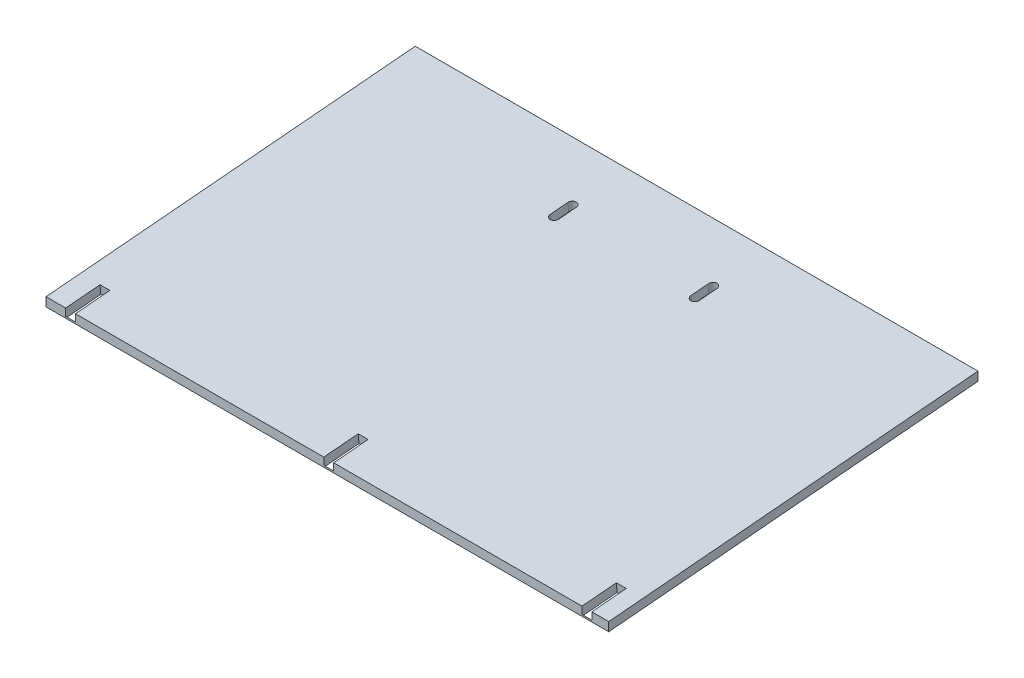
ISO-10303-21;
HEADER;
FILE_DESCRIPTION(('STEP AP214'),'2;1');
FILE_NAME('part.step','',(''),(''),'','','');
FILE_SCHEMA(('AUTOMOTIVE_DESIGN { 1 0 10303 214 1 1 1 1 }'));
ENDSEC;
DATA;
#1=APPLICATION_CONTEXT('core data for automotive mechanical design processes');
#2=APPLICATION_PROTOCOL_DEFINITION('international standard','automotive_design',2000,#1);
#3=PRODUCT_CONTEXT('',#1,'mechanical');
#4=PRODUCT('Part','Part','',(#3));
#5=PRODUCT_RELATED_PRODUCT_CATEGORY('part','',(#4));
#6=PRODUCT_DEFINITION_FORMATION('','',#4);
#7=PRODUCT_DEFINITION_CONTEXT('part definition',#1,'design');
#8=PRODUCT_DEFINITION('design','',#6,#7);
#9=PRODUCT_DEFINITION_SHAPE('','',#8);
#10=(LENGTH_UNIT() NAMED_UNIT(*) SI_UNIT(.MILLI.,.METRE.));
#11=(NAMED_UNIT(*) PLANE_ANGLE_UNIT() SI_UNIT($,.RADIAN.));
#12=(NAMED_UNIT(*) SI_UNIT($,.STERADIAN.) SOLID_ANGLE_UNIT());
#13=UNCERTAINTY_MEASURE_WITH_UNIT(LENGTH_MEASURE(1.E-05),#10,'distance_accuracy_value','');
#14=(GEOMETRIC_REPRESENTATION_CONTEXT(3) GLOBAL_UNCERTAINTY_ASSIGNED_CONTEXT((#13)) GLOBAL_UNIT_ASSIGNED_CONTEXT((#10,
#11,#12)) REPRESENTATION_CONTEXT('',''));
#15=CARTESIAN_POINT('',(0.,0.,0.));
#16=DIRECTION('',(0.,0.,1.));
#17=DIRECTION('',(1.,0.,0.));
#18=AXIS2_PLACEMENT_3D('',#15,#16,#17);
#19=CARTESIAN_POINT('',(203.2,4.14200956729703,-241.299999999994));
#20=DIRECTION('',(0.,0.,1.));
#21=DIRECTION('',(1.,0.,0.));
#22=AXIS2_PLACEMENT_3D('',#19,#20,#21);
#23=PLANE('',#22);
#24=DIRECTION('',(0.,1.,0.));
#25=VECTOR('',#24,1.);
#26=CARTESIAN_POINT('',(0.,4.14200956729703,-241.299999999994));
#27=LINE('',#26,#25);
#28=CARTESIAN_POINT('',(0.,4.14200956729703,-241.299999999994));
#29=VERTEX_POINT('',#28);
#30=CARTESIAN_POINT('',(0.,7.32913755149716,-241.299999999994));
#31=VERTEX_POINT('',#30);
#32=EDGE_CURVE('E340',#29,#31,#27,.T.);
#33=ORIENTED_EDGE('',*,*,#32,.T.);
#34=DIRECTION('',(-1.,0.,0.));
#35=VECTOR('',#34,1.);
#36=CARTESIAN_POINT('',(203.2,7.32913755149716,-241.299999999994));
#37=LINE('',#36,#35);
#38=CARTESIAN_POINT('',(203.2,7.32913755149716,-241.299999999994));
#39=VERTEX_POINT('',#38);
#40=EDGE_CURVE('E393',#39,#31,#37,.T.);
#41=ORIENTED_EDGE('',*,*,#40,.F.);
#42=DIRECTION('',(0.,1.,0.));
#43=VECTOR('',#42,1.);
#44=CARTESIAN_POINT('',(203.2,4.14200956729703,-241.299999999994));
#45=LINE('',#44,#43);
#46=CARTESIAN_POINT('',(203.2,4.14200956729703,-241.299999999994));
#47=VERTEX_POINT('',#46);
#48=EDGE_CURVE('E365',#47,#39,#45,.T.);
#49=ORIENTED_EDGE('',*,*,#48,.F.);
#50=DIRECTION('',(-1.,0.,0.));
#51=VECTOR('',#50,1.);
#52=CARTESIAN_POINT('',(203.2,4.14200956729703,-241.299999999994));
#53=LINE('',#52,#51);
#54=EDGE_CURVE('E375',#47,#29,#53,.T.);
#55=ORIENTED_EDGE('',*,*,#54,.T.);
#56=EDGE_LOOP('',(#33,#41,#49,#55));
#57=FACE_BOUND('',#56,.T.);
#58=ADVANCED_FACE('F33',(#57),#23,.F.);
#59=CARTESIAN_POINT('',(203.2,7.32913755149716,-241.299999999994));
#60=DIRECTION('',(0.,-0.996194698091746,-0.0871557427476548));
#61=DIRECTION('',(0.,0.0871557427476548,-0.996194698091746));
#62=AXIS2_PLACEMENT_3D('',#59,#60,#61);
#63=PLANE('',#62);
#64=DIRECTION('',(0.,-0.087155742747655,0.996194698091746));
#65=VECTOR('',#64,1.);
#66=CARTESIAN_POINT('',(74.676,5.61347675550961,-221.689907368058));
#67=LINE('',#66,#65);
#68=CARTESIAN_POINT('',(74.676,5.61347675550961,-221.689907368058));
#69=VERTEX_POINT('',#68);
#70=CARTESIAN_POINT('',(74.676,5.060037789062,-215.364071035175));
#71=VERTEX_POINT('',#70);
#72=EDGE_CURVE('E327',#69,#71,#67,.T.);
#73=ORIENTED_EDGE('',*,*,#72,.F.);
#74=CARTESIAN_POINT('',(76.2,5.61347675550961,-221.689907368058));
#75=DIRECTION('',(0.,0.996194698091746,0.087155742747655));
#76=DIRECTION('',(0.,0.087155742747655,-0.996194698091746));
#77=AXIS2_PLACEMENT_3D('',#74,#75,#76);
#78=CIRCLE('',#77,1.524);
#79=CARTESIAN_POINT('',(77.724,5.61347675550961,-221.689907368058));
#80=VERTEX_POINT('',#79);
#81=EDGE_CURVE('E325',#80,#69,#78,.T.);
#82=ORIENTED_EDGE('',*,*,#81,.F.);
#83=DIRECTION('',(0.,0.0871557427476552,-0.996194698091746));
#84=VECTOR('',#83,1.);
#85=CARTESIAN_POINT('',(77.724,5.61347675550961,-221.689907368058));
#86=LINE('',#85,#84);
#87=CARTESIAN_POINT('',(77.724,5.060037789062,-215.364071035175));
#88=VERTEX_POINT('',#87);
#89=EDGE_CURVE('E334',#88,#80,#86,.T.);
#90=ORIENTED_EDGE('',*,*,#89,.F.);
#91=CARTESIAN_POINT('',(76.2,5.060037789062,-215.364071035175));
#92=DIRECTION('',(0.,0.996194698091746,0.087155742747655));
#93=DIRECTION('',(0.,0.087155742747655,-0.996194698091746));
#94=AXIS2_PLACEMENT_3D('',#91,#92,#93);
#95=CIRCLE('',#94,1.524);
#96=EDGE_CURVE('E331',#71,#88,#95,.T.);
#97=ORIENTED_EDGE('',*,*,#96,.F.);
#98=EDGE_LOOP('',(#73,#82,#90,#97));
#99=FACE_BOUND('',#98,.T.);
#100=DIRECTION('',(0.,-0.0871557427476554,0.996194698091746));
#101=VECTOR('',#100,1.);
#102=CARTESIAN_POINT('',(125.476,5.61347675550961,-221.689907368058));
#103=LINE('',#102,#101);
#104=CARTESIAN_POINT('',(125.476,5.61347675550961,-221.689907368058));
#105=VERTEX_POINT('',#104);
#106=CARTESIAN_POINT('',(125.476,5.060037789062,-215.364071035175));
#107=VERTEX_POINT('',#106);
#108=EDGE_CURVE('E348',#105,#107,#103,.T.);
#109=ORIENTED_EDGE('',*,*,#108,.F.);
#110=CARTESIAN_POINT('',(127.,5.61347675550961,-221.689907368058));
#111=DIRECTION('',(0.,0.996194698091746,0.087155742747655));
#112=DIRECTION('',(0.,-0.087155742747655,0.996194698091746));
#113=AXIS2_PLACEMENT_3D('',#110,#111,#112);
#114=CIRCLE('',#113,1.52400000000001);
#115=CARTESIAN_POINT('',(128.524,5.61347675550961,-221.689907368058));
#116=VERTEX_POINT('',#115);
#117=EDGE_CURVE('E259',#116,#105,#114,.T.);
#118=ORIENTED_EDGE('',*,*,#117,.F.);
#119=DIRECTION('',(0.,0.087155742747655,-0.996194698091746));
#120=VECTOR('',#119,1.);
#121=CARTESIAN_POINT('',(128.524,5.61347675550961,-221.689907368058));
#122=LINE('',#121,#120);
#123=CARTESIAN_POINT('',(128.524,5.060037789062,-215.364071035175));
#124=VERTEX_POINT('',#123);
#125=EDGE_CURVE('E354',#124,#116,#122,.T.);
#126=ORIENTED_EDGE('',*,*,#125,.F.);
#127=CARTESIAN_POINT('',(127.,5.060037789062,-215.364071035175));
#128=DIRECTION('',(0.,0.996194698091746,0.087155742747655));
#129=DIRECTION('',(0.,-0.087155742747655,0.996194698091746));
#130=AXIS2_PLACEMENT_3D('',#127,#128,#129);
#131=CIRCLE('',#130,1.52400000000001);
#132=EDGE_CURVE('E351',#107,#124,#131,.T.);
#133=ORIENTED_EDGE('',*,*,#132,.F.);
#134=EDGE_LOOP('',(#109,#118,#126,#133));
#135=FACE_BOUND('',#134,.T.);
#136=DIRECTION('',(-1.,0.,0.));
#137=VECTOR('',#136,1.);
#138=CARTESIAN_POINT('',(7.09259223505407,-3.25016331284369,-120.378037793925));
#139=LINE('',#138,#137);
#140=CARTESIAN_POINT('',(10.6485922350541,-3.25016331284369,-120.378037793925));
#141=VERTEX_POINT('',#140);
#142=CARTESIAN_POINT('',(7.09259223505407,-3.25016331284369,-120.378037793925));
#143=VERTEX_POINT('',#142);
#144=EDGE_CURVE('E248',#141,#143,#139,.T.);
#145=ORIENTED_EDGE('',*,*,#144,.F.);
#146=DIRECTION('',(0.,0.0871557427476549,-0.996194698091746));
#147=VECTOR('',#146,1.);
#148=CARTESIAN_POINT('',(10.6485922350541,-4.35704124573891,-107.72636512816));
#149=LINE('',#148,#147);
#150=CARTESIAN_POINT('',(10.6485922350541,-4.33747572968438,-107.949999999993));
#151=VERTEX_POINT('',#150);
#152=EDGE_CURVE('E245',#151,#141,#149,.T.);
#153=ORIENTED_EDGE('',*,*,#152,.F.);
#154=DIRECTION('',(-1.,0.,0.));
#155=VECTOR('',#154,1.);
#156=CARTESIAN_POINT('',(203.2,-4.33747572968438,-107.949999999993));
#157=LINE('',#156,#155);
#158=CARTESIAN_POINT('',(100.310592235054,-4.33747572968438,-107.949999999993));
#159=VERTEX_POINT('',#158);
#160=EDGE_CURVE('E471',#159,#151,#157,.T.);
#161=ORIENTED_EDGE('',*,*,#160,.F.);
#162=DIRECTION('',(0.,-0.0871557427476549,0.996194698091746));
#163=VECTOR('',#162,1.);
#164=CARTESIAN_POINT('',(100.310592235054,-4.35704124573891,-107.72636512816));
#165=LINE('',#164,#163);
#166=CARTESIAN_POINT('',(100.310592235054,-3.25016331284369,-120.378037793925));
#167=VERTEX_POINT('',#166);
#168=EDGE_CURVE('E281',#167,#159,#165,.T.);
#169=ORIENTED_EDGE('',*,*,#168,.F.);
#170=DIRECTION('',(-1.,0.,0.));
#171=VECTOR('',#170,1.);
#172=CARTESIAN_POINT('',(100.310592235054,-3.25016331284369,-120.378037793925));
#173=LINE('',#172,#171);
#174=CARTESIAN_POINT('',(103.866592235054,-3.25016331284369,-120.378037793925));
#175=VERTEX_POINT('',#174);
#176=EDGE_CURVE('E278',#175,#167,#173,.T.);
#177=ORIENTED_EDGE('',*,*,#176,.F.);
#178=DIRECTION('',(0.,0.0871557427476549,-0.996194698091746));
#179=VECTOR('',#178,1.);
#180=CARTESIAN_POINT('',(103.866592235054,-4.35704124573891,-107.72636512816));
#181=LINE('',#180,#179);
#182=CARTESIAN_POINT('',(103.866592235054,-4.33747572968438,-107.949999999993));
#183=VERTEX_POINT('',#182);
#184=EDGE_CURVE('E275',#183,#175,#181,.T.);
#185=ORIENTED_EDGE('',*,*,#184,.F.);
#186=CARTESIAN_POINT('',(193.528592235054,-4.33747572968438,-107.949999999993));
#187=VERTEX_POINT('',#186);
#188=EDGE_CURVE('E394',#187,#183,#157,.T.);
#189=ORIENTED_EDGE('',*,*,#188,.F.);
#190=DIRECTION('',(0.,-0.0871557427476549,0.996194698091746));
#191=VECTOR('',#190,1.);
#192=CARTESIAN_POINT('',(193.528592235054,-4.35704124573891,-107.72636512816));
#193=LINE('',#192,#191);
#194=CARTESIAN_POINT('',(193.528592235054,-3.25016331284369,-120.378037793925));
#195=VERTEX_POINT('',#194);
#196=EDGE_CURVE('E313',#195,#187,#193,.T.);
#197=ORIENTED_EDGE('',*,*,#196,.F.);
#198=DIRECTION('',(-1.,0.,0.));
#199=VECTOR('',#198,1.);
#200=CARTESIAN_POINT('',(193.528592235054,-3.25016331284369,-120.378037793925));
#201=LINE('',#200,#199);
#202=CARTESIAN_POINT('',(197.084592235054,-3.25016331284369,-120.378037793925));
#203=VERTEX_POINT('',#202);
#204=EDGE_CURVE('E310',#203,#195,#201,.T.);
#205=ORIENTED_EDGE('',*,*,#204,.F.);
#206=DIRECTION('',(0.,0.0871557427476549,-0.996194698091746));
#207=VECTOR('',#206,1.);
#208=CARTESIAN_POINT('',(197.084592235054,-4.35704124573891,-107.72636512816));
#209=LINE('',#208,#207);
#210=CARTESIAN_POINT('',(197.084592235054,-4.33747572968438,-107.949999999993));
#211=VERTEX_POINT('',#210);
#212=EDGE_CURVE('E307',#211,#203,#209,.T.);
#213=ORIENTED_EDGE('',*,*,#212,.F.);
#214=CARTESIAN_POINT('',(203.2,-4.33747572968438,-107.949999999993));
#215=VERTEX_POINT('',#214);
#216=EDGE_CURVE('E390',#215,#211,#157,.T.);
#217=ORIENTED_EDGE('',*,*,#216,.F.);
#218=DIRECTION('',(0.,-0.0871557427476548,0.996194698091746));
#219=VECTOR('',#218,1.);
#220=CARTESIAN_POINT('',(203.2,7.32913755149716,-241.299999999994));
#221=LINE('',#220,#219);
#222=EDGE_CURVE('E368',#39,#215,#221,.T.);
#223=ORIENTED_EDGE('',*,*,#222,.F.);
#224=ORIENTED_EDGE('',*,*,#40,.T.);
#225=DIRECTION('',(0.,-0.0871557427476548,0.996194698091746));
#226=VECTOR('',#225,1.);
#227=CARTESIAN_POINT('',(0.,7.32913755149716,-241.299999999994));
#228=LINE('',#227,#226);
#229=CARTESIAN_POINT('',(0.,-4.33747572968438,-107.949999999993));
#230=VERTEX_POINT('',#229);
#231=EDGE_CURVE('E378',#31,#230,#228,.T.);
#232=ORIENTED_EDGE('',*,*,#231,.T.);
#233=CARTESIAN_POINT('',(7.09259223505407,-4.33747572968438,-107.949999999993));
#234=VERTEX_POINT('',#233);
#235=EDGE_CURVE('E389',#234,#230,#157,.T.);
#236=ORIENTED_EDGE('',*,*,#235,.F.);
#237=DIRECTION('',(0.,-0.0871557427476549,0.996194698091746));
#238=VECTOR('',#237,1.);
#239=CARTESIAN_POINT('',(7.09259223505407,-4.35704124573891,-107.72636512816));
#240=LINE('',#239,#238);
#241=EDGE_CURVE('E216',#143,#234,#240,.T.);
#242=ORIENTED_EDGE('',*,*,#241,.F.);
#243=EDGE_LOOP('',(#145,#153,#161,#169,#177,#185,#189,#197,#205,#213,#217,#223,#224,#232,#236,#242));
#244=FACE_BOUND('',#243,.T.);
#245=ADVANCED_FACE('F430',(#99,#135,#244),#63,.F.);
#246=CARTESIAN_POINT('',(203.2,-4.33747572968438,-107.949999999993));
#247=DIRECTION('',(0.,0.,-1.));
#248=DIRECTION('',(-1.,0.,0.));
#249=AXIS2_PLACEMENT_3D('',#246,#247,#248);
#250=PLANE('',#249);
#251=ORIENTED_EDGE('',*,*,#160,.T.);
#252=DIRECTION('',(0.,1.,0.));
#253=VECTOR('',#252,1.);
#254=CARTESIAN_POINT('',(10.6485922350541,-19.0990308860877,-107.949999999993));
#255=LINE('',#254,#253);
#256=CARTESIAN_POINT('',(10.6485922350541,-6.91319952752076,-107.949999999993));
#257=VERTEX_POINT('',#256);
#258=EDGE_CURVE('E235',#257,#151,#255,.T.);
#259=ORIENTED_EDGE('',*,*,#258,.F.);
#260=DIRECTION('',(1.,0.,0.));
#261=VECTOR('',#260,1.);
#262=CARTESIAN_POINT('',(7.09259223505407,-6.91319952752076,-107.949999999993));
#263=LINE('',#262,#261);
#264=CARTESIAN_POINT('',(7.09259223505407,-6.91319952752076,-107.949999999993));
#265=VERTEX_POINT('',#264);
#266=EDGE_CURVE('E220',#265,#257,#263,.T.);
#267=ORIENTED_EDGE('',*,*,#266,.F.);
#268=DIRECTION('',(0.,-1.,0.));
#269=VECTOR('',#268,1.);
#270=CARTESIAN_POINT('',(7.09259223505407,-19.0990308860877,-107.949999999993));
#271=LINE('',#270,#269);
#272=EDGE_CURVE('E210',#234,#265,#271,.T.);
#273=ORIENTED_EDGE('',*,*,#272,.F.);
#274=ORIENTED_EDGE('',*,*,#235,.T.);
#275=DIRECTION('',(0.,-1.,0.));
#276=VECTOR('',#275,1.);
#277=CARTESIAN_POINT('',(0.,-4.33747572968438,-107.949999999993));
#278=LINE('',#277,#276);
#279=CARTESIAN_POINT('',(0.,-7.52460371388452,-107.949999999993));
#280=VERTEX_POINT('',#279);
#281=EDGE_CURVE('E381',#230,#280,#278,.T.);
#282=ORIENTED_EDGE('',*,*,#281,.T.);
#283=DIRECTION('',(-1.,0.,0.));
#284=VECTOR('',#283,1.);
#285=CARTESIAN_POINT('',(203.2,-7.52460371388452,-107.949999999993));
#286=LINE('',#285,#284);
#287=CARTESIAN_POINT('',(203.2,-7.52460371388452,-107.949999999993));
#288=VERTEX_POINT('',#287);
#289=EDGE_CURVE('E386',#288,#280,#286,.T.);
#290=ORIENTED_EDGE('',*,*,#289,.F.);
#291=DIRECTION('',(0.,-1.,0.));
#292=VECTOR('',#291,1.);
#293=CARTESIAN_POINT('',(203.2,-4.33747572968438,-107.949999999993));
#294=LINE('',#293,#292);
#295=EDGE_CURVE('E371',#215,#288,#294,.T.);
#296=ORIENTED_EDGE('',*,*,#295,.F.);
#297=ORIENTED_EDGE('',*,*,#216,.T.);
#298=DIRECTION('',(0.,1.,0.));
#299=VECTOR('',#298,1.);
#300=CARTESIAN_POINT('',(197.084592235054,-19.0990308860877,-107.949999999993));
#301=LINE('',#300,#299);
#302=CARTESIAN_POINT('',(197.084592235054,-6.91319952752076,-107.949999999993));
#303=VERTEX_POINT('',#302);
#304=EDGE_CURVE('E293',#303,#211,#301,.T.);
#305=ORIENTED_EDGE('',*,*,#304,.F.);
#306=DIRECTION('',(1.,0.,0.));
#307=VECTOR('',#306,1.);
#308=CARTESIAN_POINT('',(193.528592235054,-6.91319952752076,-107.949999999993));
#309=LINE('',#308,#307);
#310=CARTESIAN_POINT('',(193.528592235054,-6.91319952752076,-107.949999999993));
#311=VERTEX_POINT('',#310);
#312=EDGE_CURVE('E55',#311,#303,#309,.T.);
#313=ORIENTED_EDGE('',*,*,#312,.F.);
#314=DIRECTION('',(0.,-1.,0.));
#315=VECTOR('',#314,1.);
#316=CARTESIAN_POINT('',(193.528592235054,-19.0990308860877,-107.949999999993));
#317=LINE('',#316,#315);
#318=EDGE_CURVE('E296',#187,#311,#317,.T.);
#319=ORIENTED_EDGE('',*,*,#318,.F.);
#320=ORIENTED_EDGE('',*,*,#188,.T.);
#321=DIRECTION('',(0.,1.,0.));
#322=VECTOR('',#321,1.);
#323=CARTESIAN_POINT('',(103.866592235054,-19.0990308860877,-107.949999999993));
#324=LINE('',#323,#322);
#325=CARTESIAN_POINT('',(103.866592235054,-6.91319952752076,-107.949999999993));
#326=VERTEX_POINT('',#325);
#327=EDGE_CURVE('E260',#326,#183,#324,.T.);
#328=ORIENTED_EDGE('',*,*,#327,.F.);
#329=DIRECTION('',(1.,0.,0.));
#330=VECTOR('',#329,1.);
#331=CARTESIAN_POINT('',(100.310592235054,-6.91319952752076,-107.949999999993));
#332=LINE('',#331,#330);
#333=CARTESIAN_POINT('',(100.310592235054,-6.91319952752076,-107.949999999993));
#334=VERTEX_POINT('',#333);
#335=EDGE_CURVE('E47',#334,#326,#332,.T.);
#336=ORIENTED_EDGE('',*,*,#335,.F.);
#337=DIRECTION('',(0.,-1.,0.));
#338=VECTOR('',#337,1.);
#339=CARTESIAN_POINT('',(100.310592235054,-19.0990308860877,-107.949999999993));
#340=LINE('',#339,#338);
#341=EDGE_CURVE('E264',#159,#334,#340,.T.);
#342=ORIENTED_EDGE('',*,*,#341,.F.);
#343=EDGE_LOOP('',(#251,#259,#267,#273,#274,#282,#290,#296,#297,#305,#313,#319,#320,#328,#336,#342));
#344=FACE_BOUND('',#343,.T.);
#345=ADVANCED_FACE('F234',(#344),#250,.F.);
#346=CARTESIAN_POINT('',(203.2,-7.52460371388452,-107.949999999993));
#347=DIRECTION('',(0.,0.996194698091746,0.0871557427476549));
#348=DIRECTION('',(0.,-0.0871557427476549,0.996194698091746));
#349=AXIS2_PLACEMENT_3D('',#346,#347,#348);
#350=PLANE('',#349);
#351=DIRECTION('',(-1.,0.,0.));
#352=VECTOR('',#351,1.);
#353=CARTESIAN_POINT('',(7.09259223505407,-7.51995941218022,-108.003084611383));
#354=LINE('',#353,#352);
#355=CARTESIAN_POINT('',(10.6485922350541,-7.51995941218021,-108.003084611383));
#356=VERTEX_POINT('',#355);
#357=CARTESIAN_POINT('',(7.09259223505407,-7.51995941218022,-108.003084611383));
#358=VERTEX_POINT('',#357);
#359=EDGE_CURVE('E227',#356,#358,#354,.T.);
#360=ORIENTED_EDGE('',*,*,#359,.F.);
#361=DIRECTION('',(0.,-0.0871557427476549,0.996194698091746));
#362=VECTOR('',#361,1.);
#363=CARTESIAN_POINT('',(10.6485922350541,-7.51995941218022,-108.003084611383));
#364=LINE('',#363,#362);
#365=CARTESIAN_POINT('',(10.6485922350541,-6.413081479285,-120.654757277149));
#366=VERTEX_POINT('',#365);
#367=EDGE_CURVE('E242',#366,#356,#364,.T.);
#368=ORIENTED_EDGE('',*,*,#367,.F.);
#369=DIRECTION('',(1.,0.,0.));
#370=VECTOR('',#369,1.);
#371=CARTESIAN_POINT('',(7.09259223505407,-6.413081479285,-120.654757277149));
#372=LINE('',#371,#370);
#373=CARTESIAN_POINT('',(7.09259223505407,-6.413081479285,-120.654757277149));
#374=VERTEX_POINT('',#373);
#375=EDGE_CURVE('E253',#374,#366,#372,.T.);
#376=ORIENTED_EDGE('',*,*,#375,.F.);
#377=DIRECTION('',(0.,0.0871557427476549,-0.996194698091746));
#378=VECTOR('',#377,1.);
#379=CARTESIAN_POINT('',(7.09259223505407,-7.51995941218022,-108.003084611383));
#380=LINE('',#379,#378);
#381=EDGE_CURVE('E237',#358,#374,#380,.T.);
#382=ORIENTED_EDGE('',*,*,#381,.F.);
#383=EDGE_LOOP('',(#360,#368,#376,#382));
#384=FACE_BOUND('',#383,.T.);
#385=DIRECTION('',(0.,0.0871557427476549,-0.996194698091746));
#386=VECTOR('',#385,1.);
#387=CARTESIAN_POINT('',(100.310592235054,-7.51995941218022,-108.003084611383));
#388=LINE('',#387,#386);
#389=CARTESIAN_POINT('',(100.310592235054,-7.51995941218022,-108.003084611383));
#390=VERTEX_POINT('',#389);
#391=CARTESIAN_POINT('',(100.310592235054,-6.413081479285,-120.654757277149));
#392=VERTEX_POINT('',#391);
#393=EDGE_CURVE('E269',#390,#392,#388,.T.);
#394=ORIENTED_EDGE('',*,*,#393,.F.);
#395=DIRECTION('',(-1.,0.,0.));
#396=VECTOR('',#395,1.);
#397=CARTESIAN_POINT('',(100.310592235054,-7.51995941218022,-108.003084611383));
#398=LINE('',#397,#396);
#399=CARTESIAN_POINT('',(103.866592235054,-7.51995941218022,-108.003084611383));
#400=VERTEX_POINT('',#399);
#401=EDGE_CURVE('E272',#400,#390,#398,.T.);
#402=ORIENTED_EDGE('',*,*,#401,.F.);
#403=DIRECTION('',(0.,-0.0871557427476549,0.996194698091746));
#404=VECTOR('',#403,1.);
#405=CARTESIAN_POINT('',(103.866592235054,-7.51995941218022,-108.003084611383));
#406=LINE('',#405,#404);
#407=CARTESIAN_POINT('',(103.866592235054,-6.413081479285,-120.654757277149));
#408=VERTEX_POINT('',#407);
#409=EDGE_CURVE('E221',#408,#400,#406,.T.);
#410=ORIENTED_EDGE('',*,*,#409,.F.);
#411=DIRECTION('',(1.,0.,0.));
#412=VECTOR('',#411,1.);
#413=CARTESIAN_POINT('',(100.310592235054,-6.413081479285,-120.654757277149));
#414=LINE('',#413,#412);
#415=EDGE_CURVE('E267',#392,#408,#414,.T.);
#416=ORIENTED_EDGE('',*,*,#415,.F.);
#417=EDGE_LOOP('',(#394,#402,#410,#416));
#418=FACE_BOUND('',#417,.T.);
#419=DIRECTION('',(0.,0.0871557427476549,-0.996194698091746));
#420=VECTOR('',#419,1.);
#421=CARTESIAN_POINT('',(193.528592235054,-7.51995941218022,-108.003084611383));
#422=LINE('',#421,#420);
#423=CARTESIAN_POINT('',(193.528592235054,-7.51995941218022,-108.003084611383));
#424=VERTEX_POINT('',#423);
#425=CARTESIAN_POINT('',(193.528592235054,-6.413081479285,-120.654757277149));
#426=VERTEX_POINT('',#425);
#427=EDGE_CURVE('E301',#424,#426,#422,.T.);
#428=ORIENTED_EDGE('',*,*,#427,.F.);
#429=DIRECTION('',(-1.,0.,0.));
#430=VECTOR('',#429,1.);
#431=CARTESIAN_POINT('',(193.528592235054,-7.51995941218022,-108.003084611383));
#432=LINE('',#431,#430);
#433=CARTESIAN_POINT('',(197.084592235054,-7.51995941218022,-108.003084611383));
#434=VERTEX_POINT('',#433);
#435=EDGE_CURVE('E304',#434,#424,#432,.T.);
#436=ORIENTED_EDGE('',*,*,#435,.F.);
#437=DIRECTION('',(0.,-0.0871557427476549,0.996194698091746));
#438=VECTOR('',#437,1.);
#439=CARTESIAN_POINT('',(197.084592235054,-7.51995941218022,-108.003084611383));
#440=LINE('',#439,#438);
#441=CARTESIAN_POINT('',(197.084592235054,-6.413081479285,-120.654757277149));
#442=VERTEX_POINT('',#441);
#443=EDGE_CURVE('E262',#442,#434,#440,.T.);
#444=ORIENTED_EDGE('',*,*,#443,.F.);
#445=DIRECTION('',(1.,0.,0.));
#446=VECTOR('',#445,1.);
#447=CARTESIAN_POINT('',(193.528592235054,-6.413081479285,-120.654757277149));
#448=LINE('',#447,#446);
#449=EDGE_CURVE('E299',#426,#442,#448,.T.);
#450=ORIENTED_EDGE('',*,*,#449,.F.);
#451=EDGE_LOOP('',(#428,#436,#444,#450));
#452=FACE_BOUND('',#451,.T.);
#453=DIRECTION('',(0.,0.0871557427476549,-0.996194698091746));
#454=VECTOR('',#453,1.);
#455=CARTESIAN_POINT('',(77.724,-7.52460371388452,-107.949999999993));
#456=LINE('',#455,#454);
#457=CARTESIAN_POINT('',(77.724,1.89711962262067,-215.640790518399));
#458=VERTEX_POINT('',#457);
#459=CARTESIAN_POINT('',(77.724,2.45055858906828,-221.966626851281));
#460=VERTEX_POINT('',#459);
#461=EDGE_CURVE('E40',#458,#460,#456,.T.);
#462=ORIENTED_EDGE('',*,*,#461,.T.);
#463=CARTESIAN_POINT('',(76.2,2.45055858906828,-221.966626851281));
#464=DIRECTION('',(0.,0.996194698091746,0.0871557427476549));
#465=DIRECTION('',(0.,-0.0871557427476549,0.996194698091746));
#466=AXIS2_PLACEMENT_3D('',#463,#464,#465);
#467=CIRCLE('',#466,1.524);
#468=CARTESIAN_POINT('',(74.676,2.45055858906827,-221.966626851281));
#469=VERTEX_POINT('',#468);
#470=EDGE_CURVE('E11',#460,#469,#467,.T.);
#471=ORIENTED_EDGE('',*,*,#470,.T.);
#472=DIRECTION('',(0.,-0.0871557427476549,0.996194698091746));
#473=VECTOR('',#472,1.);
#474=CARTESIAN_POINT('',(74.676,-7.52460371388452,-107.949999999993));
#475=LINE('',#474,#473);
#476=CARTESIAN_POINT('',(74.676,1.89711962262067,-215.640790518399));
#477=VERTEX_POINT('',#476);
#478=EDGE_CURVE('E409',#469,#477,#475,.T.);
#479=ORIENTED_EDGE('',*,*,#478,.T.);
#480=CARTESIAN_POINT('',(76.2,1.89711962262067,-215.640790518399));
#481=DIRECTION('',(0.,0.996194698091746,0.0871557427476549));
#482=DIRECTION('',(0.,-0.0871557427476549,0.996194698091746));
#483=AXIS2_PLACEMENT_3D('',#480,#481,#482);
#484=CIRCLE('',#483,1.524);
#485=EDGE_CURVE('E412',#477,#458,#484,.T.);
#486=ORIENTED_EDGE('',*,*,#485,.T.);
#487=EDGE_LOOP('',(#462,#471,#479,#486));
#488=FACE_BOUND('',#487,.T.);
#489=DIRECTION('',(0.,0.0871557427476549,-0.996194698091746));
#490=VECTOR('',#489,1.);
#491=CARTESIAN_POINT('',(128.524,-7.52460371388452,-107.949999999993));
#492=LINE('',#491,#490);
#493=CARTESIAN_POINT('',(128.524,1.89711962262067,-215.640790518399));
#494=VERTEX_POINT('',#493);
#495=CARTESIAN_POINT('',(128.524,2.45055858906827,-221.966626851281));
#496=VERTEX_POINT('',#495);
#497=EDGE_CURVE('E403',#494,#496,#492,.T.);
#498=ORIENTED_EDGE('',*,*,#497,.T.);
#499=CARTESIAN_POINT('',(127.,2.45055858906828,-221.966626851281));
#500=DIRECTION('',(0.,0.996194698091746,0.0871557427476549));
#501=DIRECTION('',(0.,-0.0871557427476549,0.996194698091746));
#502=AXIS2_PLACEMENT_3D('',#499,#500,#501);
#503=CIRCLE('',#502,1.52400000000001);
#504=CARTESIAN_POINT('',(125.476,2.45055858906828,-221.966626851281));
#505=VERTEX_POINT('',#504);
#506=EDGE_CURVE('E406',#496,#505,#503,.T.);
#507=ORIENTED_EDGE('',*,*,#506,.T.);
#508=DIRECTION('',(0.,-0.0871557427476549,0.996194698091746));
#509=VECTOR('',#508,1.);
#510=CARTESIAN_POINT('',(125.476,-7.52460371388452,-107.949999999993));
#511=LINE('',#510,#509);
#512=CARTESIAN_POINT('',(125.476,1.89711962262066,-215.640790518399));
#513=VERTEX_POINT('',#512);
#514=EDGE_CURVE('E397',#505,#513,#511,.T.);
#515=ORIENTED_EDGE('',*,*,#514,.T.);
#516=CARTESIAN_POINT('',(127.,1.89711962262067,-215.640790518399));
#517=DIRECTION('',(0.,0.996194698091746,0.0871557427476549));
#518=DIRECTION('',(0.,-0.0871557427476549,0.996194698091746));
#519=AXIS2_PLACEMENT_3D('',#516,#517,#518);
#520=CIRCLE('',#519,1.52400000000001);
#521=EDGE_CURVE('E400',#513,#494,#520,.T.);
#522=ORIENTED_EDGE('',*,*,#521,.T.);
#523=EDGE_LOOP('',(#498,#507,#515,#522));
#524=FACE_BOUND('',#523,.T.);
#525=DIRECTION('',(0.,0.0871557427476549,-0.996194698091746));
#526=VECTOR('',#525,1.);
#527=CARTESIAN_POINT('',(0.,-7.52460371388452,-107.949999999993));
#528=LINE('',#527,#526);
#529=EDGE_CURVE('E369',#280,#29,#528,.T.);
#530=ORIENTED_EDGE('',*,*,#529,.T.);
#531=ORIENTED_EDGE('',*,*,#54,.F.);
#532=DIRECTION('',(0.,0.0871557427476549,-0.996194698091746));
#533=VECTOR('',#532,1.);
#534=CARTESIAN_POINT('',(203.2,-7.52460371388452,-107.949999999993));
#535=LINE('',#534,#533);
#536=EDGE_CURVE('E373',#288,#47,#535,.T.);
#537=ORIENTED_EDGE('',*,*,#536,.F.);
#538=ORIENTED_EDGE('',*,*,#289,.T.);
#539=EDGE_LOOP('',(#530,#531,#537,#538));
#540=FACE_BOUND('',#539,.T.);
#541=ADVANCED_FACE('F416',(#384,#418,#452,#488,#524,#540),#350,.F.);
#542=CARTESIAN_POINT('',(203.2,0.,0.));
#543=DIRECTION('',(1.,0.,0.));
#544=DIRECTION('',(0.,0.,-1.));
#545=AXIS2_PLACEMENT_3D('',#542,#543,#544);
#546=PLANE('',#545);
#547=ORIENTED_EDGE('',*,*,#48,.T.);
#548=ORIENTED_EDGE('',*,*,#222,.T.);
#549=ORIENTED_EDGE('',*,*,#295,.T.);
#550=ORIENTED_EDGE('',*,*,#536,.T.);
#551=EDGE_LOOP('',(#547,#548,#549,#550));
#552=FACE_BOUND('',#551,.T.);
#553=ADVANCED_FACE('F467',(#552),#546,.T.);
#554=CARTESIAN_POINT('',(0.,0.,0.));
#555=DIRECTION('',(1.,0.,0.));
#556=DIRECTION('',(0.,0.,-1.));
#557=AXIS2_PLACEMENT_3D('',#554,#555,#556);
#558=PLANE('',#557);
#559=ORIENTED_EDGE('',*,*,#32,.F.);
#560=ORIENTED_EDGE('',*,*,#529,.F.);
#561=ORIENTED_EDGE('',*,*,#281,.F.);
#562=ORIENTED_EDGE('',*,*,#231,.F.);
#563=EDGE_LOOP('',(#559,#560,#561,#562));
#564=FACE_BOUND('',#563,.T.);
#565=ADVANCED_FACE('F459',(#564),#558,.F.);
#566=CARTESIAN_POINT('',(127.,-9.1274336568739,-222.979569919192));
#567=DIRECTION('',(0.,0.996194698091746,0.087155742747655));
#568=DIRECTION('',(0.,-0.087155742747655,0.996194698091746));
#569=AXIS2_PLACEMENT_3D('',#566,#567,#568);
#570=CYLINDRICAL_SURFACE('',#569,1.52400000000001);
#571=DIRECTION('',(0.,0.996194698091746,0.087155742747655));
#572=VECTOR('',#571,1.);
#573=CARTESIAN_POINT('',(128.524,-9.1274336568739,-222.979569919192));
#574=LINE('',#573,#572);
#575=EDGE_CURVE('E328',#496,#116,#574,.T.);
#576=ORIENTED_EDGE('',*,*,#575,.T.);
#577=ORIENTED_EDGE('',*,*,#117,.T.);
#578=DIRECTION('',(0.,0.996194698091746,0.087155742747655));
#579=VECTOR('',#578,1.);
#580=CARTESIAN_POINT('',(125.476,-9.1274336568739,-222.979569919192));
#581=LINE('',#580,#579);
#582=EDGE_CURVE('E357',#505,#105,#581,.T.);
#583=ORIENTED_EDGE('',*,*,#582,.F.);
#584=ORIENTED_EDGE('',*,*,#506,.F.);
#585=EDGE_LOOP('',(#576,#577,#583,#584));
#586=FACE_BOUND('',#585,.T.);
#587=ADVANCED_FACE('F550',(#586),#570,.F.);
#588=CARTESIAN_POINT('',(128.524,-9.1274336568739,-222.979569919192));
#589=DIRECTION('',(1.,0.,0.));
#590=DIRECTION('',(0.,0.,-1.));
#591=AXIS2_PLACEMENT_3D('',#588,#589,#590);
#592=PLANE('',#591);
#593=DIRECTION('',(0.,0.996194698091746,0.087155742747655));
#594=VECTOR('',#593,1.);
#595=CARTESIAN_POINT('',(128.524,-9.68087262332151,-216.65373358631));
#596=LINE('',#595,#594);
#597=EDGE_CURVE('E359',#494,#124,#596,.T.);
#598=ORIENTED_EDGE('',*,*,#597,.T.);
#599=ORIENTED_EDGE('',*,*,#125,.T.);
#600=ORIENTED_EDGE('',*,*,#575,.F.);
#601=ORIENTED_EDGE('',*,*,#497,.F.);
#602=EDGE_LOOP('',(#598,#599,#600,#601));
#603=FACE_BOUND('',#602,.T.);
#604=ADVANCED_FACE('F547',(#603),#592,.F.);
#605=CARTESIAN_POINT('',(127.,-9.68087262332151,-216.65373358631));
#606=DIRECTION('',(0.,0.996194698091746,0.087155742747655));
#607=DIRECTION('',(0.,-0.087155742747655,0.996194698091746));
#608=AXIS2_PLACEMENT_3D('',#605,#606,#607);
#609=CYLINDRICAL_SURFACE('',#608,1.52400000000001);
#610=DIRECTION('',(0.,0.996194698091746,0.087155742747655));
#611=VECTOR('',#610,1.);
#612=CARTESIAN_POINT('',(125.476,-9.68087262332151,-216.65373358631));
#613=LINE('',#612,#611);
#614=EDGE_CURVE('E361',#513,#107,#613,.T.);
#615=ORIENTED_EDGE('',*,*,#614,.T.);
#616=ORIENTED_EDGE('',*,*,#132,.T.);
#617=ORIENTED_EDGE('',*,*,#597,.F.);
#618=ORIENTED_EDGE('',*,*,#521,.F.);
#619=EDGE_LOOP('',(#615,#616,#617,#618));
#620=FACE_BOUND('',#619,.T.);
#621=ADVANCED_FACE('F543',(#620),#609,.F.);
#622=CARTESIAN_POINT('',(125.476,-9.1274336568739,-222.979569919192));
#623=DIRECTION('',(-1.,0.,0.));
#624=DIRECTION('',(0.,0.,1.));
#625=AXIS2_PLACEMENT_3D('',#622,#623,#624);
#626=PLANE('',#625);
#627=ORIENTED_EDGE('',*,*,#582,.T.);
#628=ORIENTED_EDGE('',*,*,#108,.T.);
#629=ORIENTED_EDGE('',*,*,#614,.F.);
#630=ORIENTED_EDGE('',*,*,#514,.F.);
#631=EDGE_LOOP('',(#627,#628,#629,#630));
#632=FACE_BOUND('',#631,.T.);
#633=ADVANCED_FACE('F539',(#632),#626,.F.);
#634=CARTESIAN_POINT('',(76.2,-9.1274336568739,-222.979569919192));
#635=DIRECTION('',(0.,0.996194698091746,0.087155742747655));
#636=DIRECTION('',(0.,-0.087155742747655,0.996194698091746));
#637=AXIS2_PLACEMENT_3D('',#634,#635,#636);
#638=CYLINDRICAL_SURFACE('',#637,1.524);
#639=DIRECTION('',(0.,0.996194698091746,0.087155742747655));
#640=VECTOR('',#639,1.);
#641=CARTESIAN_POINT('',(77.724,-9.1274336568739,-222.979569919192));
#642=LINE('',#641,#640);
#643=EDGE_CURVE('E338',#460,#80,#642,.T.);
#644=ORIENTED_EDGE('',*,*,#643,.T.);
#645=ORIENTED_EDGE('',*,*,#81,.T.);
#646=DIRECTION('',(0.,0.996194698091746,0.087155742747655));
#647=VECTOR('',#646,1.);
#648=CARTESIAN_POINT('',(74.676,-9.1274336568739,-222.979569919192));
#649=LINE('',#648,#647);
#650=EDGE_CURVE('E337',#469,#69,#649,.T.);
#651=ORIENTED_EDGE('',*,*,#650,.F.);
#652=ORIENTED_EDGE('',*,*,#470,.F.);
#653=EDGE_LOOP('',(#644,#645,#651,#652));
#654=FACE_BOUND('',#653,.T.);
#655=ADVANCED_FACE('F434',(#654),#638,.F.);
#656=CARTESIAN_POINT('',(77.724,-9.1274336568739,-222.979569919192));
#657=DIRECTION('',(1.,0.,0.));
#658=DIRECTION('',(0.,0.,-1.));
#659=AXIS2_PLACEMENT_3D('',#656,#657,#658);
#660=PLANE('',#659);
#661=DIRECTION('',(0.,0.996194698091746,0.087155742747655));
#662=VECTOR('',#661,1.);
#663=CARTESIAN_POINT('',(77.724,-9.68087262332151,-216.65373358631));
#664=LINE('',#663,#662);
#665=EDGE_CURVE('E341',#458,#88,#664,.T.);
#666=ORIENTED_EDGE('',*,*,#665,.T.);
#667=ORIENTED_EDGE('',*,*,#89,.T.);
#668=ORIENTED_EDGE('',*,*,#643,.F.);
#669=ORIENTED_EDGE('',*,*,#461,.F.);
#670=EDGE_LOOP('',(#666,#667,#668,#669));
#671=FACE_BOUND('',#670,.T.);
#672=ADVANCED_FACE('F422',(#671),#660,.F.);
#673=CARTESIAN_POINT('',(76.2,-9.68087262332151,-216.65373358631));
#674=DIRECTION('',(0.,0.996194698091746,0.087155742747655));
#675=DIRECTION('',(0.,-0.087155742747655,0.996194698091746));
#676=AXIS2_PLACEMENT_3D('',#673,#674,#675);
#677=CYLINDRICAL_SURFACE('',#676,1.524);
#678=DIRECTION('',(0.,0.996194698091746,0.087155742747655));
#679=VECTOR('',#678,1.);
#680=CARTESIAN_POINT('',(74.676,-9.68087262332151,-216.65373358631));
#681=LINE('',#680,#679);
#682=EDGE_CURVE('E343',#477,#71,#681,.T.);
#683=ORIENTED_EDGE('',*,*,#682,.T.);
#684=ORIENTED_EDGE('',*,*,#96,.T.);
#685=ORIENTED_EDGE('',*,*,#665,.F.);
#686=ORIENTED_EDGE('',*,*,#485,.F.);
#687=EDGE_LOOP('',(#683,#684,#685,#686));
#688=FACE_BOUND('',#687,.T.);
#689=ADVANCED_FACE('F424',(#688),#677,.F.);
#690=CARTESIAN_POINT('',(74.676,-9.1274336568739,-222.979569919192));
#691=DIRECTION('',(-1.,0.,0.));
#692=DIRECTION('',(0.,0.,1.));
#693=AXIS2_PLACEMENT_3D('',#690,#691,#692);
#694=PLANE('',#693);
#695=ORIENTED_EDGE('',*,*,#650,.T.);
#696=ORIENTED_EDGE('',*,*,#72,.T.);
#697=ORIENTED_EDGE('',*,*,#682,.F.);
#698=ORIENTED_EDGE('',*,*,#478,.F.);
#699=EDGE_LOOP('',(#695,#696,#697,#698));
#700=FACE_BOUND('',#699,.T.);
#701=ADVANCED_FACE('F436',(#700),#694,.F.);
#702=CARTESIAN_POINT('',(193.528592235054,-19.0990308860877,-109.016122099507));
#703=DIRECTION('',(0.,-0.0871557427476548,0.996194698091746));
#704=DIRECTION('',(0.,-0.996194698091746,-0.0871557427476548));
#705=AXIS2_PLACEMENT_3D('',#702,#703,#704);
#706=PLANE('',#705);
#707=ORIENTED_EDGE('',*,*,#312,.T.);
#708=DIRECTION('',(0.,0.996194698091746,0.0871557427476548));
#709=VECTOR('',#708,1.);
#710=CARTESIAN_POINT('',(197.084592235054,-19.0990308860877,-109.016122099507));
#711=LINE('',#710,#709);
#712=EDGE_CURVE('E315',#434,#303,#711,.T.);
#713=ORIENTED_EDGE('',*,*,#712,.F.);
#714=ORIENTED_EDGE('',*,*,#435,.T.);
#715=DIRECTION('',(0.,0.996194698091746,0.0871557427476548));
#716=VECTOR('',#715,1.);
#717=CARTESIAN_POINT('',(193.528592235054,-19.0990308860877,-109.016122099507));
#718=LINE('',#717,#716);
#719=EDGE_CURVE('E316',#424,#311,#718,.T.);
#720=ORIENTED_EDGE('',*,*,#719,.T.);
#721=EDGE_LOOP('',(#707,#713,#714,#720));
#722=FACE_BOUND('',#721,.T.);
#723=ADVANCED_FACE('F438',(#722),#706,.F.);
#724=CARTESIAN_POINT('',(193.528592235054,-19.0990308860877,-109.016122099507));
#725=DIRECTION('',(-1.,0.,0.));
#726=DIRECTION('',(0.,0.,1.));
#727=AXIS2_PLACEMENT_3D('',#724,#725,#726);
#728=PLANE('',#727);
#729=ORIENTED_EDGE('',*,*,#318,.T.);
#730=ORIENTED_EDGE('',*,*,#719,.F.);
#731=ORIENTED_EDGE('',*,*,#427,.T.);
#732=DIRECTION('',(0.,0.996194698091746,0.0871557427476548));
#733=VECTOR('',#732,1.);
#734=CARTESIAN_POINT('',(193.528592235054,-17.9921529531925,-121.667794765272));
#735=LINE('',#734,#733);
#736=EDGE_CURVE('E318',#426,#195,#735,.T.);
#737=ORIENTED_EDGE('',*,*,#736,.T.);
#738=ORIENTED_EDGE('',*,*,#196,.T.);
#739=EDGE_LOOP('',(#729,#730,#731,#737,#738));
#740=FACE_BOUND('',#739,.T.);
#741=ADVANCED_FACE('F444',(#740),#728,.F.);
#742=CARTESIAN_POINT('',(193.528592235054,-17.9921529531925,-121.667794765272));
#743=DIRECTION('',(0.,0.0871557427476548,-0.996194698091746));
#744=DIRECTION('',(0.,0.996194698091746,0.0871557427476548));
#745=AXIS2_PLACEMENT_3D('',#742,#743,#744);
#746=PLANE('',#745);
#747=ORIENTED_EDGE('',*,*,#449,.T.);
#748=DIRECTION('',(0.,0.996194698091746,0.0871557427476548));
#749=VECTOR('',#748,1.);
#750=CARTESIAN_POINT('',(197.084592235054,-17.9921529531925,-121.667794765272));
#751=LINE('',#750,#749);
#752=EDGE_CURVE('E320',#442,#203,#751,.T.);
#753=ORIENTED_EDGE('',*,*,#752,.T.);
#754=ORIENTED_EDGE('',*,*,#204,.T.);
#755=ORIENTED_EDGE('',*,*,#736,.F.);
#756=EDGE_LOOP('',(#747,#753,#754,#755));
#757=FACE_BOUND('',#756,.T.);
#758=ADVANCED_FACE('F527',(#757),#746,.F.);
#759=CARTESIAN_POINT('',(197.084592235054,-19.0990308860877,-109.016122099507));
#760=DIRECTION('',(1.,0.,0.));
#761=DIRECTION('',(0.,0.,-1.));
#762=AXIS2_PLACEMENT_3D('',#759,#760,#761);
#763=PLANE('',#762);
#764=ORIENTED_EDGE('',*,*,#304,.T.);
#765=ORIENTED_EDGE('',*,*,#212,.T.);
#766=ORIENTED_EDGE('',*,*,#752,.F.);
#767=ORIENTED_EDGE('',*,*,#443,.T.);
#768=ORIENTED_EDGE('',*,*,#712,.T.);
#769=EDGE_LOOP('',(#764,#765,#766,#767,#768));
#770=FACE_BOUND('',#769,.T.);
#771=ADVANCED_FACE('F524',(#770),#763,.F.);
#772=CARTESIAN_POINT('',(100.310592235054,-19.0990308860877,-109.016122099507));
#773=DIRECTION('',(0.,-0.0871557427476548,0.996194698091746));
#774=DIRECTION('',(0.,-0.996194698091746,-0.0871557427476548));
#775=AXIS2_PLACEMENT_3D('',#772,#773,#774);
#776=PLANE('',#775);
#777=ORIENTED_EDGE('',*,*,#335,.T.);
#778=DIRECTION('',(0.,0.996194698091746,0.0871557427476548));
#779=VECTOR('',#778,1.);
#780=CARTESIAN_POINT('',(103.866592235054,-19.0990308860877,-109.016122099507));
#781=LINE('',#780,#779);
#782=EDGE_CURVE('E283',#400,#326,#781,.T.);
#783=ORIENTED_EDGE('',*,*,#782,.F.);
#784=ORIENTED_EDGE('',*,*,#401,.T.);
#785=DIRECTION('',(0.,0.996194698091746,0.0871557427476548));
#786=VECTOR('',#785,1.);
#787=CARTESIAN_POINT('',(100.310592235054,-19.0990308860877,-109.016122099507));
#788=LINE('',#787,#786);
#789=EDGE_CURVE('E284',#390,#334,#788,.T.);
#790=ORIENTED_EDGE('',*,*,#789,.T.);
#791=EDGE_LOOP('',(#777,#783,#784,#790));
#792=FACE_BOUND('',#791,.T.);
#793=ADVANCED_FACE('F488',(#792),#776,.F.);
#794=CARTESIAN_POINT('',(100.310592235054,-19.0990308860877,-109.016122099507));
#795=DIRECTION('',(-1.,0.,0.));
#796=DIRECTION('',(0.,0.,1.));
#797=AXIS2_PLACEMENT_3D('',#794,#795,#796);
#798=PLANE('',#797);
#799=ORIENTED_EDGE('',*,*,#341,.T.);
#800=ORIENTED_EDGE('',*,*,#789,.F.);
#801=ORIENTED_EDGE('',*,*,#393,.T.);
#802=DIRECTION('',(0.,0.996194698091746,0.0871557427476548));
#803=VECTOR('',#802,1.);
#804=CARTESIAN_POINT('',(100.310592235054,-17.9921529531925,-121.667794765272));
#805=LINE('',#804,#803);
#806=EDGE_CURVE('E286',#392,#167,#805,.T.);
#807=ORIENTED_EDGE('',*,*,#806,.T.);
#808=ORIENTED_EDGE('',*,*,#168,.T.);
#809=EDGE_LOOP('',(#799,#800,#801,#807,#808));
#810=FACE_BOUND('',#809,.T.);
#811=ADVANCED_FACE('F494',(#810),#798,.F.);
#812=CARTESIAN_POINT('',(100.310592235054,-17.9921529531925,-121.667794765272));
#813=DIRECTION('',(0.,0.0871557427476548,-0.996194698091746));
#814=DIRECTION('',(0.,0.996194698091746,0.0871557427476548));
#815=AXIS2_PLACEMENT_3D('',#812,#813,#814);
#816=PLANE('',#815);
#817=ORIENTED_EDGE('',*,*,#415,.T.);
#818=DIRECTION('',(0.,0.996194698091746,0.0871557427476548));
#819=VECTOR('',#818,1.);
#820=CARTESIAN_POINT('',(103.866592235054,-17.9921529531925,-121.667794765272));
#821=LINE('',#820,#819);
#822=EDGE_CURVE('E288',#408,#175,#821,.T.);
#823=ORIENTED_EDGE('',*,*,#822,.T.);
#824=ORIENTED_EDGE('',*,*,#176,.T.);
#825=ORIENTED_EDGE('',*,*,#806,.F.);
#826=EDGE_LOOP('',(#817,#823,#824,#825));
#827=FACE_BOUND('',#826,.T.);
#828=ADVANCED_FACE('F516',(#827),#816,.F.);
#829=CARTESIAN_POINT('',(103.866592235054,-19.0990308860877,-109.016122099507));
#830=DIRECTION('',(1.,0.,0.));
#831=DIRECTION('',(0.,0.,-1.));
#832=AXIS2_PLACEMENT_3D('',#829,#830,#831);
#833=PLANE('',#832);
#834=ORIENTED_EDGE('',*,*,#327,.T.);
#835=ORIENTED_EDGE('',*,*,#184,.T.);
#836=ORIENTED_EDGE('',*,*,#822,.F.);
#837=ORIENTED_EDGE('',*,*,#409,.T.);
#838=ORIENTED_EDGE('',*,*,#782,.T.);
#839=EDGE_LOOP('',(#834,#835,#836,#837,#838));
#840=FACE_BOUND('',#839,.T.);
#841=ADVANCED_FACE('F485',(#840),#833,.F.);
#842=CARTESIAN_POINT('',(10.6485922350541,-19.0990308860877,-109.016122099507));
#843=DIRECTION('',(1.,0.,0.));
#844=DIRECTION('',(0.,0.,-1.));
#845=AXIS2_PLACEMENT_3D('',#842,#843,#844);
#846=PLANE('',#845);
#847=ORIENTED_EDGE('',*,*,#258,.T.);
#848=ORIENTED_EDGE('',*,*,#152,.T.);
#849=DIRECTION('',(0.,0.996194698091746,0.0871557427476548));
#850=VECTOR('',#849,1.);
#851=CARTESIAN_POINT('',(10.6485922350541,-17.9921529531925,-121.667794765272));
#852=LINE('',#851,#850);
#853=EDGE_CURVE('E252',#366,#141,#852,.T.);
#854=ORIENTED_EDGE('',*,*,#853,.F.);
#855=ORIENTED_EDGE('',*,*,#367,.T.);
#856=DIRECTION('',(0.,0.996194698091746,0.0871557427476548));
#857=VECTOR('',#856,1.);
#858=CARTESIAN_POINT('',(10.6485922350541,-19.0990308860877,-109.016122099507));
#859=LINE('',#858,#857);
#860=EDGE_CURVE('E229',#356,#257,#859,.T.);
#861=ORIENTED_EDGE('',*,*,#860,.T.);
#862=EDGE_LOOP('',(#847,#848,#854,#855,#861));
#863=FACE_BOUND('',#862,.T.);
#864=ADVANCED_FACE('F497',(#863),#846,.F.);
#865=CARTESIAN_POINT('',(7.09259223505407,-19.0990308860877,-109.016122099507));
#866=DIRECTION('',(0.,-0.0871557427476548,0.996194698091746));
#867=DIRECTION('',(0.,-0.996194698091746,-0.0871557427476548));
#868=AXIS2_PLACEMENT_3D('',#865,#866,#867);
#869=PLANE('',#868);
#870=ORIENTED_EDGE('',*,*,#266,.T.);
#871=ORIENTED_EDGE('',*,*,#860,.F.);
#872=ORIENTED_EDGE('',*,*,#359,.T.);
#873=DIRECTION('',(0.,0.996194698091746,0.0871557427476548));
#874=VECTOR('',#873,1.);
#875=CARTESIAN_POINT('',(7.09259223505407,-19.0990308860877,-109.016122099507));
#876=LINE('',#875,#874);
#877=EDGE_CURVE('E213',#358,#265,#876,.T.);
#878=ORIENTED_EDGE('',*,*,#877,.T.);
#879=EDGE_LOOP('',(#870,#871,#872,#878));
#880=FACE_BOUND('',#879,.T.);
#881=ADVANCED_FACE('F224',(#880),#869,.F.);
#882=CARTESIAN_POINT('',(7.09259223505407,-19.0990308860877,-109.016122099507));
#883=DIRECTION('',(-1.,0.,0.));
#884=DIRECTION('',(0.,0.,1.));
#885=AXIS2_PLACEMENT_3D('',#882,#883,#884);
#886=PLANE('',#885);
#887=ORIENTED_EDGE('',*,*,#272,.T.);
#888=ORIENTED_EDGE('',*,*,#877,.F.);
#889=ORIENTED_EDGE('',*,*,#381,.T.);
#890=DIRECTION('',(0.,0.996194698091746,0.0871557427476548));
#891=VECTOR('',#890,1.);
#892=CARTESIAN_POINT('',(7.09259223505407,-17.9921529531925,-121.667794765272));
#893=LINE('',#892,#891);
#894=EDGE_CURVE('E230',#374,#143,#893,.T.);
#895=ORIENTED_EDGE('',*,*,#894,.T.);
#896=ORIENTED_EDGE('',*,*,#241,.T.);
#897=EDGE_LOOP('',(#887,#888,#889,#895,#896));
#898=FACE_BOUND('',#897,.T.);
#899=ADVANCED_FACE('F212',(#898),#886,.F.);
#900=CARTESIAN_POINT('',(7.09259223505407,-17.9921529531925,-121.667794765272));
#901=DIRECTION('',(0.,0.0871557427476548,-0.996194698091746));
#902=DIRECTION('',(0.,0.996194698091746,0.0871557427476548));
#903=AXIS2_PLACEMENT_3D('',#900,#901,#902);
#904=PLANE('',#903);
#905=ORIENTED_EDGE('',*,*,#375,.T.);
#906=ORIENTED_EDGE('',*,*,#853,.T.);
#907=ORIENTED_EDGE('',*,*,#144,.T.);
#908=ORIENTED_EDGE('',*,*,#894,.F.);
#909=EDGE_LOOP('',(#905,#906,#907,#908));
#910=FACE_BOUND('',#909,.T.);
#911=ADVANCED_FACE('F503',(#910),#904,.F.);
#912=CLOSED_SHELL('',(#58,#245,#345,#541,#553,#565,#587,#604,#621,#633,#655,#672,#689,#701,#723,
#741,#758,#771,#793,#811,#828,#841,#864,#881,#899,#911));
#913=MANIFOLD_SOLID_BREP('B2',#912);
#914=ADVANCED_BREP_SHAPE_REPRESENTATION('',(#18,#913),#14);
#915=SHAPE_DEFINITION_REPRESENTATION(#9,#914);
ENDSEC;
END-ISO-10303-21;
